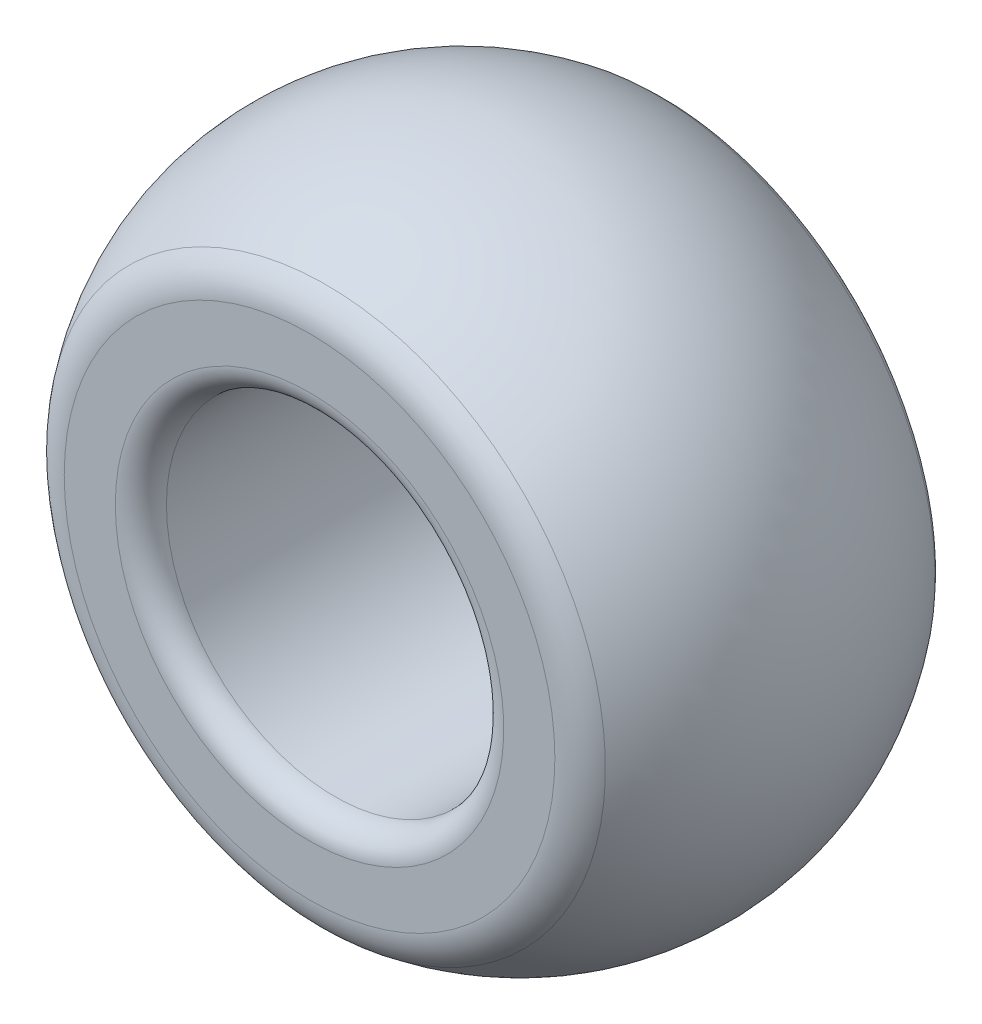
ISO-10303-21;
HEADER;
FILE_DESCRIPTION(('STEP AP214'),'2;1');
FILE_NAME('part.step','',(''),(''),'','','');
FILE_SCHEMA(('AUTOMOTIVE_DESIGN { 1 0 10303 214 1 1 1 1 }'));
ENDSEC;
DATA;
#1=APPLICATION_CONTEXT('core data for automotive mechanical design processes');
#2=APPLICATION_PROTOCOL_DEFINITION('international standard','automotive_design',2000,#1);
#3=PRODUCT_CONTEXT('',#1,'mechanical');
#4=PRODUCT('Part','Part','',(#3));
#5=PRODUCT_RELATED_PRODUCT_CATEGORY('part','',(#4));
#6=PRODUCT_DEFINITION_FORMATION('','',#4);
#7=PRODUCT_DEFINITION_CONTEXT('part definition',#1,'design');
#8=PRODUCT_DEFINITION('design','',#6,#7);
#9=PRODUCT_DEFINITION_SHAPE('','',#8);
#10=(LENGTH_UNIT() NAMED_UNIT(*) SI_UNIT(.MILLI.,.METRE.));
#11=(NAMED_UNIT(*) PLANE_ANGLE_UNIT() SI_UNIT($,.RADIAN.));
#12=(NAMED_UNIT(*) SI_UNIT($,.STERADIAN.) SOLID_ANGLE_UNIT());
#13=UNCERTAINTY_MEASURE_WITH_UNIT(LENGTH_MEASURE(1.E-05),#10,'distance_accuracy_value','');
#14=(GEOMETRIC_REPRESENTATION_CONTEXT(3) GLOBAL_UNCERTAINTY_ASSIGNED_CONTEXT((#13)) GLOBAL_UNIT_ASSIGNED_CONTEXT((#10,
#11,#12)) REPRESENTATION_CONTEXT('',''));
#15=CARTESIAN_POINT('',(0.,0.,0.));
#16=DIRECTION('',(0.,0.,1.));
#17=DIRECTION('',(1.,0.,0.));
#18=AXIS2_PLACEMENT_3D('',#15,#16,#17);
#19=CARTESIAN_POINT('',(-17.1934568051831,0.,-0.906600666879975));
#20=DIRECTION('',(0.,0.,-1.));
#21=DIRECTION('',(-1.,0.,0.));
#22=AXIS2_PLACEMENT_3D('',#19,#20,#21);
#23=DEGENERATE_TOROIDAL_SURFACE('',#22,0.385947332421796,1.6079526675782,.T.);
#24=CARTESIAN_POINT('',(-17.1934568051831,0.,0.0737622061147275));
#25=DIRECTION('',(0.,0.,-1.));
#26=DIRECTION('',(-1.,0.,0.));
#27=AXIS2_PLACEMENT_3D('',#24,#25,#26);
#28=CIRCLE('',#27,1.66046701388043);
#29=CARTESIAN_POINT('',(-18.8539238190635,0.,0.0737622061147275));
#30=VERTEX_POINT('',#29);
#31=EDGE_CURVE('E10',#30,#30,#28,.T.);
#32=ORIENTED_EDGE('',*,*,#31,.T.);
#33=EDGE_LOOP('',(#32));
#34=FACE_BOUND('',#33,.T.);
#35=CARTESIAN_POINT('',(-17.1934568051831,0.,-1.88696353987467));
#36=DIRECTION('',(0.,0.,-1.));
#37=DIRECTION('',(-1.,0.,0.));
#38=AXIS2_PLACEMENT_3D('',#35,#36,#37);
#39=CIRCLE('',#38,1.66046701388044);
#40=CARTESIAN_POINT('',(-18.8539238190635,0.,-1.88696353987467));
#41=VERTEX_POINT('',#40);
#42=EDGE_CURVE('E58',#41,#41,#39,.T.);
#43=ORIENTED_EDGE('',*,*,#42,.F.);
#44=EDGE_LOOP('',(#43));
#45=FACE_BOUND('',#44,.T.);
#46=ADVANCED_FACE('F30',(#34,#45),#23,.T.);
#47=CARTESIAN_POINT('',(-17.1934568051831,0.,-0.081100666879975));
#48=DIRECTION('',(0.,0.,-1.));
#49=DIRECTION('',(-1.,0.,0.));
#50=AXIS2_PLACEMENT_3D('',#47,#48,#49);
#51=TOROIDAL_SURFACE('',#50,1.45913770511535,0.253999999999999);
#52=CARTESIAN_POINT('',(-17.1934568051831,0.,0.172899333120025));
#53=DIRECTION('',(0.,0.,-1.));
#54=DIRECTION('',(-1.,0.,0.));
#55=AXIS2_PLACEMENT_3D('',#52,#53,#54);
#56=CIRCLE('',#55,1.45913770511535);
#57=CARTESIAN_POINT('',(-18.6525945102984,0.,0.172899333120025));
#58=VERTEX_POINT('',#57);
#59=EDGE_CURVE('E36',#58,#58,#56,.T.);
#60=ORIENTED_EDGE('',*,*,#59,.T.);
#61=EDGE_LOOP('',(#60));
#62=FACE_BOUND('',#61,.T.);
#63=ORIENTED_EDGE('',*,*,#31,.F.);
#64=EDGE_LOOP('',(#63));
#65=FACE_BOUND('',#64,.T.);
#66=ADVANCED_FACE('F65',(#62,#65),#51,.T.);
#67=CARTESIAN_POINT('',(-20.6811129908172,0.,0.172899333120025));
#68=DIRECTION('',(0.,0.,-1.));
#69=DIRECTION('',(-1.,0.,0.));
#70=AXIS2_PLACEMENT_3D('',#67,#68,#69);
#71=PLANE('',#70);
#72=ORIENTED_EDGE('',*,*,#59,.F.);
#73=EDGE_LOOP('',(#72));
#74=FACE_BOUND('',#73,.T.);
#75=CARTESIAN_POINT('',(-17.1934568051831,0.,0.172899333120025));
#76=DIRECTION('',(0.,0.,-1.));
#77=DIRECTION('',(-1.,0.,0.));
#78=AXIS2_PLACEMENT_3D('',#75,#76,#77);
#79=CIRCLE('',#78,1.15531430086733);
#80=CARTESIAN_POINT('',(-18.3487711060504,0.,0.172899333120025));
#81=VERTEX_POINT('',#80);
#82=EDGE_CURVE('E40',#81,#81,#79,.T.);
#83=ORIENTED_EDGE('',*,*,#82,.T.);
#84=EDGE_LOOP('',(#83));
#85=FACE_BOUND('',#84,.T.);
#86=ADVANCED_FACE('F69',(#74,#85),#71,.F.);
#87=CARTESIAN_POINT('',(-17.1934568051831,0.,0.0208850322526951));
#88=DIRECTION('',(0.,0.,-1.));
#89=DIRECTION('',(-1.,0.,0.));
#90=AXIS2_PLACEMENT_3D('',#87,#88,#89);
#91=TOROIDAL_SURFACE('',#90,1.15531430086733,0.15201430086733);
#92=CARTESIAN_POINT('',(-17.1934568051831,0.,0.0208850322526951));
#93=DIRECTION('',(0.,0.,-1.));
#94=DIRECTION('',(-1.,0.,0.));
#95=AXIS2_PLACEMENT_3D('',#92,#93,#94);
#96=CIRCLE('',#95,1.0033);
#97=CARTESIAN_POINT('',(-18.1967568051831,0.,0.0208850322526951));
#98=VERTEX_POINT('',#97);
#99=EDGE_CURVE('E44',#98,#98,#96,.T.);
#100=ORIENTED_EDGE('',*,*,#99,.T.);
#101=EDGE_LOOP('',(#100));
#102=FACE_BOUND('',#101,.T.);
#103=ORIENTED_EDGE('',*,*,#82,.F.);
#104=EDGE_LOOP('',(#103));
#105=FACE_BOUND('',#104,.T.);
#106=ADVANCED_FACE('F73',(#102,#105),#91,.T.);
#107=CARTESIAN_POINT('',(-17.1934568051831,0.,-1.49010945209507));
#108=DIRECTION('',(0.,0.,-1.));
#109=DIRECTION('',(-1.,0.,0.));
#110=AXIS2_PLACEMENT_3D('',#107,#108,#109);
#111=CYLINDRICAL_SURFACE('',#110,1.0033);
#112=ORIENTED_EDGE('',*,*,#99,.F.);
#113=EDGE_LOOP('',(#112));
#114=FACE_BOUND('',#113,.T.);
#115=CARTESIAN_POINT('',(-17.1934568051831,0.,-1.83408636601264));
#116=DIRECTION('',(0.,0.,-1.));
#117=DIRECTION('',(-1.,0.,0.));
#118=AXIS2_PLACEMENT_3D('',#115,#116,#117);
#119=CIRCLE('',#118,1.0033);
#120=CARTESIAN_POINT('',(-18.1967568051831,0.,-1.83408636601264));
#121=VERTEX_POINT('',#120);
#122=EDGE_CURVE('E49',#121,#121,#119,.T.);
#123=ORIENTED_EDGE('',*,*,#122,.T.);
#124=EDGE_LOOP('',(#123));
#125=FACE_BOUND('',#124,.T.);
#126=ADVANCED_FACE('F80',(#114,#125),#111,.F.);
#127=CARTESIAN_POINT('',(-17.1934568051831,0.,-1.83408636601264));
#128=DIRECTION('',(0.,0.,-1.));
#129=DIRECTION('',(-1.,0.,0.));
#130=AXIS2_PLACEMENT_3D('',#127,#128,#129);
#131=TOROIDAL_SURFACE('',#130,1.15531430086733,0.15201430086733);
#132=ORIENTED_EDGE('',*,*,#122,.F.);
#133=EDGE_LOOP('',(#132));
#134=FACE_BOUND('',#133,.T.);
#135=CARTESIAN_POINT('',(-17.1934568051831,0.,-1.98610066687997));
#136=DIRECTION('',(0.,0.,-1.));
#137=DIRECTION('',(-1.,0.,0.));
#138=AXIS2_PLACEMENT_3D('',#135,#136,#137);
#139=CIRCLE('',#138,1.15531430086733);
#140=CARTESIAN_POINT('',(-18.3487711060504,0.,-1.98610066687997));
#141=VERTEX_POINT('',#140);
#142=EDGE_CURVE('E52',#141,#141,#139,.T.);
#143=ORIENTED_EDGE('',*,*,#142,.T.);
#144=EDGE_LOOP('',(#143));
#145=FACE_BOUND('',#144,.T.);
#146=ADVANCED_FACE('F84',(#134,#145),#131,.T.);
#147=CARTESIAN_POINT('',(-20.6811129908172,0.,-1.98610066687997));
#148=DIRECTION('',(0.,0.,-1.));
#149=DIRECTION('',(-1.,0.,0.));
#150=AXIS2_PLACEMENT_3D('',#147,#148,#149);
#151=PLANE('',#150);
#152=CARTESIAN_POINT('',(-17.1934568051831,0.,-1.98610066687997));
#153=DIRECTION('',(0.,0.,-1.));
#154=DIRECTION('',(-1.,0.,0.));
#155=AXIS2_PLACEMENT_3D('',#152,#153,#154);
#156=CIRCLE('',#155,1.45913770511535);
#157=CARTESIAN_POINT('',(-18.6525945102984,0.,-1.98610066687997));
#158=VERTEX_POINT('',#157);
#159=EDGE_CURVE('E55',#158,#158,#156,.T.);
#160=ORIENTED_EDGE('',*,*,#159,.T.);
#161=EDGE_LOOP('',(#160));
#162=FACE_BOUND('',#161,.T.);
#163=ORIENTED_EDGE('',*,*,#142,.F.);
#164=EDGE_LOOP('',(#163));
#165=FACE_BOUND('',#164,.T.);
#166=ADVANCED_FACE('F88',(#162,#165),#151,.T.);
#167=CARTESIAN_POINT('',(-17.1934568051831,0.,-1.73210066687998));
#168=DIRECTION('',(0.,0.,-1.));
#169=DIRECTION('',(-1.,0.,0.));
#170=AXIS2_PLACEMENT_3D('',#167,#168,#169);
#171=TOROIDAL_SURFACE('',#170,1.45913770511535,0.254);
#172=ORIENTED_EDGE('',*,*,#159,.F.);
#173=EDGE_LOOP('',(#172));
#174=FACE_BOUND('',#173,.T.);
#175=ORIENTED_EDGE('',*,*,#42,.T.);
#176=EDGE_LOOP('',(#175));
#177=FACE_BOUND('',#176,.T.);
#178=ADVANCED_FACE('F62',(#174,#177),#171,.T.);
#179=CLOSED_SHELL('',(#46,#66,#86,#106,#126,#146,#166,#178));
#180=MANIFOLD_SOLID_BREP('B2',#179);
#181=ADVANCED_BREP_SHAPE_REPRESENTATION('',(#18,#180),#14);
#182=SHAPE_DEFINITION_REPRESENTATION(#9,#181);
ENDSEC;
END-ISO-10303-21;
